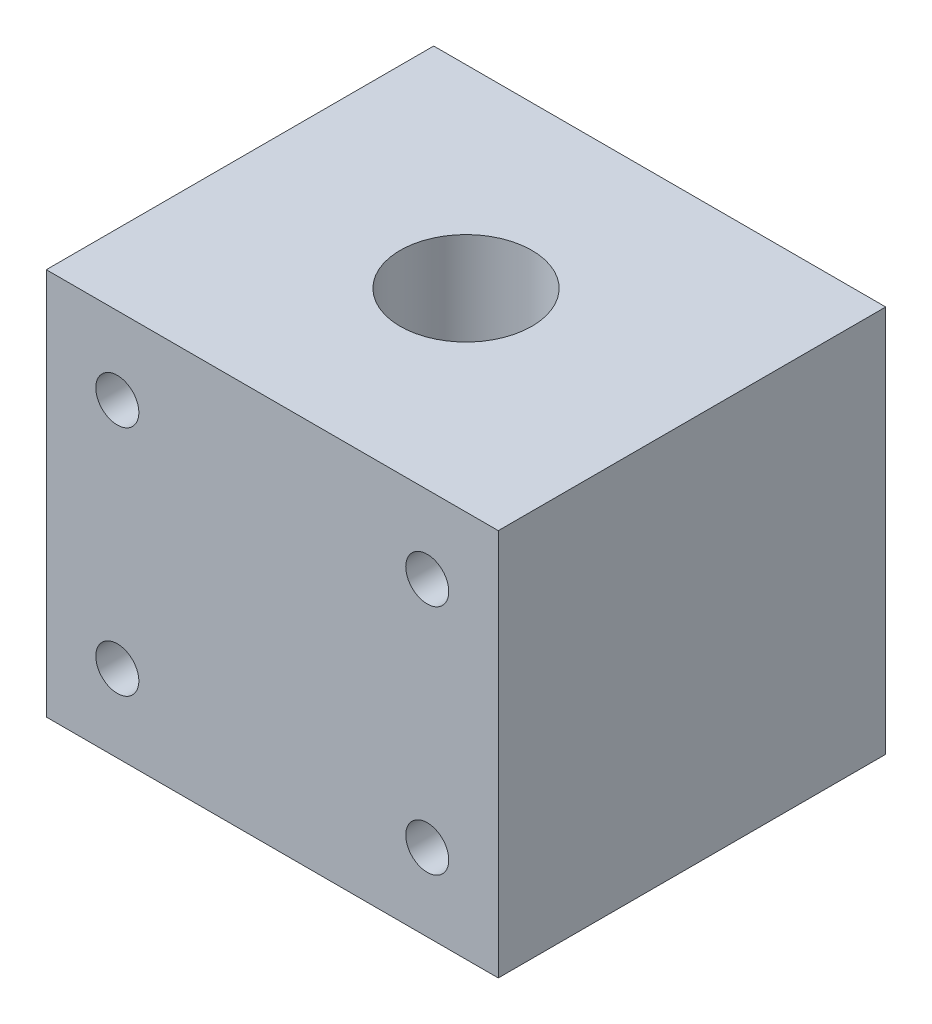
ISO-10303-21;
HEADER;
FILE_DESCRIPTION(('STEP AP214'),'2;1');
FILE_NAME('part.step','',(''),(''),'','','');
FILE_SCHEMA(('AUTOMOTIVE_DESIGN { 1 0 10303 214 1 1 1 1 }'));
ENDSEC;
DATA;
#1=APPLICATION_CONTEXT('core data for automotive mechanical design processes');
#2=APPLICATION_PROTOCOL_DEFINITION('international standard','automotive_design',2000,#1);
#3=PRODUCT_CONTEXT('',#1,'mechanical');
#4=PRODUCT('Part','Part','',(#3));
#5=PRODUCT_RELATED_PRODUCT_CATEGORY('part','',(#4));
#6=PRODUCT_DEFINITION_FORMATION('','',#4);
#7=PRODUCT_DEFINITION_CONTEXT('part definition',#1,'design');
#8=PRODUCT_DEFINITION('design','',#6,#7);
#9=PRODUCT_DEFINITION_SHAPE('','',#8);
#10=(LENGTH_UNIT() NAMED_UNIT(*) SI_UNIT(.MILLI.,.METRE.));
#11=(NAMED_UNIT(*) PLANE_ANGLE_UNIT() SI_UNIT($,.RADIAN.));
#12=(NAMED_UNIT(*) SI_UNIT($,.STERADIAN.) SOLID_ANGLE_UNIT());
#13=UNCERTAINTY_MEASURE_WITH_UNIT(LENGTH_MEASURE(1.E-05),#10,'distance_accuracy_value','');
#14=(GEOMETRIC_REPRESENTATION_CONTEXT(3) GLOBAL_UNCERTAINTY_ASSIGNED_CONTEXT((#13)) GLOBAL_UNIT_ASSIGNED_CONTEXT((#10,
#11,#12)) REPRESENTATION_CONTEXT('',''));
#15=CARTESIAN_POINT('',(0.,0.,0.));
#16=DIRECTION('',(0.,0.,1.));
#17=DIRECTION('',(1.,0.,0.));
#18=AXIS2_PLACEMENT_3D('',#15,#16,#17);
#19=CARTESIAN_POINT('',(0.,30.,0.));
#20=DIRECTION('',(0.,1.,0.));
#21=DIRECTION('',(1.,0.,0.));
#22=AXIS2_PLACEMENT_3D('',#19,#20,#21);
#23=PLANE('',#22);
#24=CARTESIAN_POINT('',(0.,30.,0.));
#25=DIRECTION('',(0.,-1.,0.));
#26=DIRECTION('',(-1.,0.,0.));
#27=AXIS2_PLACEMENT_3D('',#24,#25,#26);
#28=CIRCLE('',#27,5.1);
#29=CARTESIAN_POINT('',(5.1,30.,0.));
#30=VERTEX_POINT('',#29);
#31=EDGE_CURVE('E168',#30,#30,#28,.T.);
#32=ORIENTED_EDGE('',*,*,#31,.T.);
#33=EDGE_LOOP('',(#32));
#34=FACE_BOUND('',#33,.T.);
#35=DIRECTION('',(0.,0.,-1.));
#36=VECTOR('',#35,1.);
#37=CARTESIAN_POINT('',(17.5,30.,15.));
#38=LINE('',#37,#36);
#39=CARTESIAN_POINT('',(17.5,30.,15.));
#40=VERTEX_POINT('',#39);
#41=CARTESIAN_POINT('',(17.5,30.,-15.));
#42=VERTEX_POINT('',#41);
#43=EDGE_CURVE('E11',#40,#42,#38,.T.);
#44=ORIENTED_EDGE('',*,*,#43,.T.);
#45=DIRECTION('',(-1.,0.,0.));
#46=VECTOR('',#45,1.);
#47=CARTESIAN_POINT('',(17.5,30.,-15.));
#48=LINE('',#47,#46);
#49=CARTESIAN_POINT('',(-17.5,30.,-15.));
#50=VERTEX_POINT('',#49);
#51=EDGE_CURVE('E141',#42,#50,#48,.T.);
#52=ORIENTED_EDGE('',*,*,#51,.T.);
#53=DIRECTION('',(0.,0.,1.));
#54=VECTOR('',#53,1.);
#55=CARTESIAN_POINT('',(-17.5,30.,-15.));
#56=LINE('',#55,#54);
#57=CARTESIAN_POINT('',(-17.5,30.,15.));
#58=VERTEX_POINT('',#57);
#59=EDGE_CURVE('E174',#50,#58,#56,.T.);
#60=ORIENTED_EDGE('',*,*,#59,.T.);
#61=DIRECTION('',(1.,0.,0.));
#62=VECTOR('',#61,1.);
#63=CARTESIAN_POINT('',(-17.5,30.,15.));
#64=LINE('',#63,#62);
#65=EDGE_CURVE('E230',#58,#40,#64,.T.);
#66=ORIENTED_EDGE('',*,*,#65,.T.);
#67=EDGE_LOOP('',(#44,#52,#60,#66));
#68=FACE_BOUND('',#67,.T.);
#69=ADVANCED_FACE('F16',(#34,#68),#23,.T.);
#70=CARTESIAN_POINT('',(17.5,0.,15.));
#71=DIRECTION('',(1.,0.,0.));
#72=DIRECTION('',(0.,0.,-1.));
#73=AXIS2_PLACEMENT_3D('',#70,#71,#72);
#74=PLANE('',#73);
#75=DIRECTION('',(0.,0.,-1.));
#76=VECTOR('',#75,1.);
#77=CARTESIAN_POINT('',(17.5,0.,15.));
#78=LINE('',#77,#76);
#79=CARTESIAN_POINT('',(17.5,0.,15.));
#80=VERTEX_POINT('',#79);
#81=CARTESIAN_POINT('',(17.5,0.,-15.));
#82=VERTEX_POINT('',#81);
#83=EDGE_CURVE('E150',#80,#82,#78,.T.);
#84=ORIENTED_EDGE('',*,*,#83,.T.);
#85=DIRECTION('',(0.,1.,0.));
#86=VECTOR('',#85,1.);
#87=CARTESIAN_POINT('',(17.5,0.,-15.));
#88=LINE('',#87,#86);
#89=EDGE_CURVE('E27',#82,#42,#88,.T.);
#90=ORIENTED_EDGE('',*,*,#89,.T.);
#91=ORIENTED_EDGE('',*,*,#43,.F.);
#92=DIRECTION('',(0.,1.,0.));
#93=VECTOR('',#92,1.);
#94=CARTESIAN_POINT('',(17.5,0.,15.));
#95=LINE('',#94,#93);
#96=EDGE_CURVE('E135',#80,#40,#95,.T.);
#97=ORIENTED_EDGE('',*,*,#96,.F.);
#98=EDGE_LOOP('',(#84,#90,#91,#97));
#99=FACE_BOUND('',#98,.T.);
#100=ADVANCED_FACE('F315',(#99),#74,.T.);
#101=CARTESIAN_POINT('',(17.5,0.,-15.));
#102=DIRECTION('',(0.,0.,-1.));
#103=DIRECTION('',(0.,-1.,0.));
#104=AXIS2_PLACEMENT_3D('',#101,#102,#103);
#105=PLANE('',#104);
#106=DIRECTION('',(-1.,0.,0.));
#107=VECTOR('',#106,1.);
#108=CARTESIAN_POINT('',(17.5,0.,-15.));
#109=LINE('',#108,#107);
#110=CARTESIAN_POINT('',(-17.5,0.,-15.));
#111=VERTEX_POINT('',#110);
#112=EDGE_CURVE('E244',#82,#111,#109,.T.);
#113=ORIENTED_EDGE('',*,*,#112,.T.);
#114=DIRECTION('',(0.,1.,0.));
#115=VECTOR('',#114,1.);
#116=CARTESIAN_POINT('',(-17.5,0.,-15.));
#117=LINE('',#116,#115);
#118=EDGE_CURVE('E143',#111,#50,#117,.T.);
#119=ORIENTED_EDGE('',*,*,#118,.T.);
#120=ORIENTED_EDGE('',*,*,#51,.F.);
#121=ORIENTED_EDGE('',*,*,#89,.F.);
#122=EDGE_LOOP('',(#113,#119,#120,#121));
#123=FACE_BOUND('',#122,.T.);
#124=ADVANCED_FACE('F321',(#123),#105,.T.);
#125=CARTESIAN_POINT('',(-17.5,0.,-15.));
#126=DIRECTION('',(-1.,0.,0.));
#127=DIRECTION('',(0.,1.,0.));
#128=AXIS2_PLACEMENT_3D('',#125,#126,#127);
#129=PLANE('',#128);
#130=DIRECTION('',(0.,0.,1.));
#131=VECTOR('',#130,1.);
#132=CARTESIAN_POINT('',(-17.5,0.,-15.));
#133=LINE('',#132,#131);
#134=CARTESIAN_POINT('',(-17.5,0.,15.));
#135=VERTEX_POINT('',#134);
#136=EDGE_CURVE('E241',#111,#135,#133,.T.);
#137=ORIENTED_EDGE('',*,*,#136,.T.);
#138=DIRECTION('',(0.,1.,0.));
#139=VECTOR('',#138,1.);
#140=CARTESIAN_POINT('',(-17.5,0.,15.));
#141=LINE('',#140,#139);
#142=EDGE_CURVE('E178',#135,#58,#141,.T.);
#143=ORIENTED_EDGE('',*,*,#142,.T.);
#144=ORIENTED_EDGE('',*,*,#59,.F.);
#145=ORIENTED_EDGE('',*,*,#118,.F.);
#146=EDGE_LOOP('',(#137,#143,#144,#145));
#147=FACE_BOUND('',#146,.T.);
#148=ADVANCED_FACE('F350',(#147),#129,.T.);
#149=CARTESIAN_POINT('',(-17.5,0.,15.));
#150=DIRECTION('',(0.,0.,1.));
#151=DIRECTION('',(1.,0.,0.));
#152=AXIS2_PLACEMENT_3D('',#149,#150,#151);
#153=PLANE('',#152);
#154=CARTESIAN_POINT('',(-12.,6.,15.));
#155=DIRECTION('',(0.,0.,-1.));
#156=DIRECTION('',(1.,0.,0.));
#157=AXIS2_PLACEMENT_3D('',#154,#155,#156);
#158=CIRCLE('',#157,1.666);
#159=CARTESIAN_POINT('',(-13.666,6.,15.));
#160=VERTEX_POINT('',#159);
#161=EDGE_CURVE('E224',#160,#160,#158,.T.);
#162=ORIENTED_EDGE('',*,*,#161,.T.);
#163=EDGE_LOOP('',(#162));
#164=FACE_BOUND('',#163,.T.);
#165=CARTESIAN_POINT('',(12.,24.,15.));
#166=DIRECTION('',(0.,0.,-1.));
#167=DIRECTION('',(1.,0.,0.));
#168=AXIS2_PLACEMENT_3D('',#165,#166,#167);
#169=CIRCLE('',#168,1.666);
#170=CARTESIAN_POINT('',(10.334,24.,15.));
#171=VERTEX_POINT('',#170);
#172=EDGE_CURVE('E20',#171,#171,#169,.T.);
#173=ORIENTED_EDGE('',*,*,#172,.T.);
#174=EDGE_LOOP('',(#173));
#175=FACE_BOUND('',#174,.T.);
#176=CARTESIAN_POINT('',(-12.,24.,15.));
#177=DIRECTION('',(0.,0.,-1.));
#178=DIRECTION('',(1.,0.,0.));
#179=AXIS2_PLACEMENT_3D('',#176,#177,#178);
#180=CIRCLE('',#179,1.666);
#181=CARTESIAN_POINT('',(-13.666,24.,15.));
#182=VERTEX_POINT('',#181);
#183=EDGE_CURVE('E116',#182,#182,#180,.T.);
#184=ORIENTED_EDGE('',*,*,#183,.T.);
#185=EDGE_LOOP('',(#184));
#186=FACE_BOUND('',#185,.T.);
#187=CARTESIAN_POINT('',(12.,6.,15.));
#188=DIRECTION('',(0.,0.,-1.));
#189=DIRECTION('',(1.,0.,0.));
#190=AXIS2_PLACEMENT_3D('',#187,#188,#189);
#191=CIRCLE('',#190,1.666);
#192=CARTESIAN_POINT('',(10.334,6.,15.));
#193=VERTEX_POINT('',#192);
#194=EDGE_CURVE('E166',#193,#193,#191,.T.);
#195=ORIENTED_EDGE('',*,*,#194,.T.);
#196=EDGE_LOOP('',(#195));
#197=FACE_BOUND('',#196,.T.);
#198=DIRECTION('',(1.,0.,0.));
#199=VECTOR('',#198,1.);
#200=CARTESIAN_POINT('',(-17.5,0.,15.));
#201=LINE('',#200,#199);
#202=EDGE_CURVE('E154',#135,#80,#201,.T.);
#203=ORIENTED_EDGE('',*,*,#202,.T.);
#204=ORIENTED_EDGE('',*,*,#96,.T.);
#205=ORIENTED_EDGE('',*,*,#65,.F.);
#206=ORIENTED_EDGE('',*,*,#142,.F.);
#207=EDGE_LOOP('',(#203,#204,#205,#206));
#208=FACE_BOUND('',#207,.T.);
#209=ADVANCED_FACE('F292',(#164,#175,#186,#197,#208),#153,.T.);
#210=CARTESIAN_POINT('',(0.,0.,0.));
#211=DIRECTION('',(0.,1.,0.));
#212=DIRECTION('',(1.,0.,0.));
#213=AXIS2_PLACEMENT_3D('',#210,#211,#212);
#214=PLANE('',#213);
#215=CARTESIAN_POINT('',(0.,0.,0.));
#216=DIRECTION('',(0.,1.,0.));
#217=DIRECTION('',(-1.,0.,0.));
#218=AXIS2_PLACEMENT_3D('',#215,#216,#217);
#219=CIRCLE('',#218,11.);
#220=CARTESIAN_POINT('',(11.,0.,0.));
#221=VERTEX_POINT('',#220);
#222=EDGE_CURVE('E204',#221,#221,#219,.T.);
#223=ORIENTED_EDGE('',*,*,#222,.T.);
#224=EDGE_LOOP('',(#223));
#225=FACE_BOUND('',#224,.T.);
#226=ORIENTED_EDGE('',*,*,#83,.F.);
#227=ORIENTED_EDGE('',*,*,#202,.F.);
#228=ORIENTED_EDGE('',*,*,#136,.F.);
#229=ORIENTED_EDGE('',*,*,#112,.F.);
#230=EDGE_LOOP('',(#226,#227,#228,#229));
#231=FACE_BOUND('',#230,.T.);
#232=ADVANCED_FACE('F347',(#225,#231),#214,.F.);
#233=CARTESIAN_POINT('',(0.,4.,0.));
#234=DIRECTION('',(0.,1.,0.));
#235=DIRECTION('',(1.,0.,0.));
#236=AXIS2_PLACEMENT_3D('',#233,#234,#235);
#237=PLANE('',#236);
#238=CARTESIAN_POINT('',(0.,4.,0.));
#239=DIRECTION('',(0.,-1.,0.));
#240=DIRECTION('',(-1.,0.,0.));
#241=AXIS2_PLACEMENT_3D('',#238,#239,#240);
#242=CIRCLE('',#241,5.1);
#243=CARTESIAN_POINT('',(5.1,4.,0.));
#244=VERTEX_POINT('',#243);
#245=EDGE_CURVE('E202',#244,#244,#242,.T.);
#246=ORIENTED_EDGE('',*,*,#245,.F.);
#247=EDGE_LOOP('',(#246));
#248=FACE_BOUND('',#247,.T.);
#249=CARTESIAN_POINT('',(8.,4.,0.));
#250=DIRECTION('',(0.,1.,0.));
#251=DIRECTION('',(0.,0.,-1.));
#252=AXIS2_PLACEMENT_3D('',#249,#250,#251);
#253=CIRCLE('',#252,1.2645);
#254=CARTESIAN_POINT('',(8.,4.,1.2645));
#255=VERTEX_POINT('',#254);
#256=EDGE_CURVE('E191',#255,#255,#253,.T.);
#257=ORIENTED_EDGE('',*,*,#256,.T.);
#258=EDGE_LOOP('',(#257));
#259=FACE_BOUND('',#258,.T.);
#260=CARTESIAN_POINT('',(-8.,4.,0.));
#261=DIRECTION('',(0.,1.,0.));
#262=DIRECTION('',(0.,0.,-1.));
#263=AXIS2_PLACEMENT_3D('',#260,#261,#262);
#264=CIRCLE('',#263,1.2645);
#265=CARTESIAN_POINT('',(-8.,4.,1.2645));
#266=VERTEX_POINT('',#265);
#267=EDGE_CURVE('E162',#266,#266,#264,.T.);
#268=ORIENTED_EDGE('',*,*,#267,.T.);
#269=EDGE_LOOP('',(#268));
#270=FACE_BOUND('',#269,.T.);
#271=CARTESIAN_POINT('',(0.,4.,0.));
#272=DIRECTION('',(0.,1.,0.));
#273=DIRECTION('',(-1.,0.,0.));
#274=AXIS2_PLACEMENT_3D('',#271,#272,#273);
#275=CIRCLE('',#274,11.);
#276=CARTESIAN_POINT('',(11.,4.,0.));
#277=VERTEX_POINT('',#276);
#278=EDGE_CURVE('E155',#277,#277,#275,.T.);
#279=ORIENTED_EDGE('',*,*,#278,.F.);
#280=EDGE_LOOP('',(#279));
#281=FACE_BOUND('',#280,.T.);
#282=ADVANCED_FACE('F344',(#248,#259,#270,#281),#237,.F.);
#283=CARTESIAN_POINT('',(0.,0.,0.));
#284=DIRECTION('',(0.,1.,0.));
#285=DIRECTION('',(-1.,0.,0.));
#286=AXIS2_PLACEMENT_3D('',#283,#284,#285);
#287=CYLINDRICAL_SURFACE('',#286,11.);
#288=ORIENTED_EDGE('',*,*,#222,.F.);
#289=DIRECTION('',(0.,1.,0.));
#290=VECTOR('',#289,1.);
#291=CARTESIAN_POINT('',(11.,0.,0.));
#292=LINE('',#291,#290);
#293=EDGE_CURVE('E205',#221,#277,#292,.T.);
#294=ORIENTED_EDGE('',*,*,#293,.T.);
#295=ORIENTED_EDGE('',*,*,#278,.T.);
#296=ORIENTED_EDGE('',*,*,#293,.F.);
#297=EDGE_LOOP('',(#288,#294,#295,#296));
#298=FACE_BOUND('',#297,.T.);
#299=ADVANCED_FACE('F342',(#298),#287,.F.);
#300=CARTESIAN_POINT('',(0.,0.,0.));
#301=DIRECTION('',(0.,1.,0.));
#302=DIRECTION('',(-1.,0.,0.));
#303=AXIS2_PLACEMENT_3D('',#300,#301,#302);
#304=CYLINDRICAL_SURFACE('',#303,5.1);
#305=ORIENTED_EDGE('',*,*,#31,.F.);
#306=DIRECTION('',(0.,-1.,0.));
#307=VECTOR('',#306,1.);
#308=CARTESIAN_POINT('',(5.1,0.,0.));
#309=LINE('',#308,#307);
#310=EDGE_CURVE('E172',#30,#244,#309,.T.);
#311=ORIENTED_EDGE('',*,*,#310,.T.);
#312=ORIENTED_EDGE('',*,*,#245,.T.);
#313=ORIENTED_EDGE('',*,*,#310,.F.);
#314=EDGE_LOOP('',(#305,#311,#312,#313));
#315=FACE_BOUND('',#314,.T.);
#316=ADVANCED_FACE('F339',(#315),#304,.F.);
#317=CARTESIAN_POINT('',(8.,8.5,0.));
#318=DIRECTION('',(0.,1.,0.));
#319=DIRECTION('',(0.,0.,-1.));
#320=AXIS2_PLACEMENT_3D('',#317,#318,#319);
#321=CYLINDRICAL_SURFACE('',#320,1.2645);
#322=ORIENTED_EDGE('',*,*,#256,.F.);
#323=DIRECTION('',(0.,1.,0.));
#324=VECTOR('',#323,1.);
#325=CARTESIAN_POINT('',(8.,8.5,1.2645));
#326=LINE('',#325,#324);
#327=CARTESIAN_POINT('',(8.,13.,1.2645));
#328=VERTEX_POINT('',#327);
#329=EDGE_CURVE('E173',#255,#328,#326,.T.);
#330=ORIENTED_EDGE('',*,*,#329,.T.);
#331=CARTESIAN_POINT('',(8.,13.,0.));
#332=DIRECTION('',(0.,1.,0.));
#333=DIRECTION('',(0.,0.,-1.));
#334=AXIS2_PLACEMENT_3D('',#331,#332,#333);
#335=CIRCLE('',#334,1.2645);
#336=EDGE_CURVE('E161',#328,#328,#335,.T.);
#337=ORIENTED_EDGE('',*,*,#336,.T.);
#338=ORIENTED_EDGE('',*,*,#329,.F.);
#339=EDGE_LOOP('',(#322,#330,#337,#338));
#340=FACE_BOUND('',#339,.T.);
#341=ADVANCED_FACE('F18',(#340),#321,.F.);
#342=CARTESIAN_POINT('',(8.,13.3798236046367,0.));
#343=DIRECTION('',(0.,-1.,0.));
#344=DIRECTION('',(0.,0.,-1.));
#345=AXIS2_PLACEMENT_3D('',#342,#343,#344);
#346=CONICAL_SURFACE('',#345,0.632367367890697,1.02974425867665);
#347=ORIENTED_EDGE('',*,*,#336,.F.);
#348=DIRECTION('',(0.,0.515038074910054,-0.857167300702112));
#349=VECTOR('',#348,1.);
#350=CARTESIAN_POINT('',(8.,13.3798236046367,0.632367367890697));
#351=LINE('',#350,#349);
#352=CARTESIAN_POINT('',(8.,13.7597882527603,0.));
#353=VERTEX_POINT('',#352);
#354=EDGE_CURVE('E187',#328,#353,#351,.T.);
#355=ORIENTED_EDGE('',*,*,#354,.T.);
#356=ORIENTED_EDGE('',*,*,#354,.F.);
#357=EDGE_LOOP('',(#347,#355,#356));
#358=FACE_BOUND('',#357,.T.);
#359=ADVANCED_FACE('F468',(#358),#346,.F.);
#360=CARTESIAN_POINT('',(-8.,8.5,0.));
#361=DIRECTION('',(0.,1.,0.));
#362=DIRECTION('',(0.,0.,-1.));
#363=AXIS2_PLACEMENT_3D('',#360,#361,#362);
#364=CYLINDRICAL_SURFACE('',#363,1.2645);
#365=ORIENTED_EDGE('',*,*,#267,.F.);
#366=DIRECTION('',(0.,1.,0.));
#367=VECTOR('',#366,1.);
#368=CARTESIAN_POINT('',(-8.,8.5,1.2645));
#369=LINE('',#368,#367);
#370=CARTESIAN_POINT('',(-8.,13.,1.2645));
#371=VERTEX_POINT('',#370);
#372=EDGE_CURVE('E158',#266,#371,#369,.T.);
#373=ORIENTED_EDGE('',*,*,#372,.T.);
#374=CARTESIAN_POINT('',(-8.,13.,0.));
#375=DIRECTION('',(0.,1.,0.));
#376=DIRECTION('',(0.,0.,-1.));
#377=AXIS2_PLACEMENT_3D('',#374,#375,#376);
#378=CIRCLE('',#377,1.2645);
#379=EDGE_CURVE('E186',#371,#371,#378,.T.);
#380=ORIENTED_EDGE('',*,*,#379,.T.);
#381=ORIENTED_EDGE('',*,*,#372,.F.);
#382=EDGE_LOOP('',(#365,#373,#380,#381));
#383=FACE_BOUND('',#382,.T.);
#384=ADVANCED_FACE('F473',(#383),#364,.F.);
#385=CARTESIAN_POINT('',(-8.,13.3798236046367,0.));
#386=DIRECTION('',(0.,-1.,0.));
#387=DIRECTION('',(0.,0.,-1.));
#388=AXIS2_PLACEMENT_3D('',#385,#386,#387);
#389=CONICAL_SURFACE('',#388,0.632367367890697,1.02974425867665);
#390=ORIENTED_EDGE('',*,*,#379,.F.);
#391=DIRECTION('',(0.,0.515038074910054,-0.857167300702112));
#392=VECTOR('',#391,1.);
#393=CARTESIAN_POINT('',(-8.,13.3798236046367,0.632367367890697));
#394=LINE('',#393,#392);
#395=CARTESIAN_POINT('',(-8.,13.7597882527603,0.));
#396=VERTEX_POINT('',#395);
#397=EDGE_CURVE('E182',#371,#396,#394,.T.);
#398=ORIENTED_EDGE('',*,*,#397,.T.);
#399=ORIENTED_EDGE('',*,*,#397,.F.);
#400=EDGE_LOOP('',(#390,#398,#399));
#401=FACE_BOUND('',#400,.T.);
#402=ADVANCED_FACE('F483',(#401),#389,.F.);
#403=CARTESIAN_POINT('',(-12.,6.,9.5));
#404=DIRECTION('',(0.,0.,-1.));
#405=DIRECTION('',(1.,0.,0.));
#406=AXIS2_PLACEMENT_3D('',#403,#404,#405);
#407=CYLINDRICAL_SURFACE('',#406,1.666);
#408=ORIENTED_EDGE('',*,*,#161,.F.);
#409=DIRECTION('',(0.,0.,-1.));
#410=VECTOR('',#409,1.);
#411=CARTESIAN_POINT('',(-13.666,6.,9.5));
#412=LINE('',#411,#410);
#413=CARTESIAN_POINT('',(-13.666,6.,4.));
#414=VERTEX_POINT('',#413);
#415=EDGE_CURVE('E236',#160,#414,#412,.T.);
#416=ORIENTED_EDGE('',*,*,#415,.T.);
#417=CARTESIAN_POINT('',(-12.,6.,4.));
#418=DIRECTION('',(0.,0.,-1.));
#419=DIRECTION('',(1.,0.,0.));
#420=AXIS2_PLACEMENT_3D('',#417,#418,#419);
#421=CIRCLE('',#420,1.666);
#422=EDGE_CURVE('E148',#414,#414,#421,.T.);
#423=ORIENTED_EDGE('',*,*,#422,.T.);
#424=ORIENTED_EDGE('',*,*,#415,.F.);
#425=EDGE_LOOP('',(#408,#416,#423,#424));
#426=FACE_BOUND('',#425,.T.);
#427=ADVANCED_FACE('F478',(#426),#407,.F.);
#428=CARTESIAN_POINT('',(-12.,6.,3.49934206086313));
#429=DIRECTION('',(0.,0.,1.));
#430=DIRECTION('',(1.,0.,0.));
#431=AXIS2_PLACEMENT_3D('',#428,#429,#430);
#432=CONICAL_SURFACE('',#431,0.832765264218607,1.02974425867665);
#433=ORIENTED_EDGE('',*,*,#422,.F.);
#434=DIRECTION('',(0.857167300702112,0.,-0.515038074910054));
#435=VECTOR('',#434,1.);
#436=CARTESIAN_POINT('',(-12.8327652642186,6.,3.49934206086313));
#437=LINE('',#436,#435);
#438=CARTESIAN_POINT('',(-12.,6.,2.99896620870009));
#439=VERTEX_POINT('',#438);
#440=EDGE_CURVE('E195',#414,#439,#437,.T.);
#441=ORIENTED_EDGE('',*,*,#440,.T.);
#442=ORIENTED_EDGE('',*,*,#440,.F.);
#443=EDGE_LOOP('',(#433,#441,#442));
#444=FACE_BOUND('',#443,.T.);
#445=ADVANCED_FACE('F310',(#444),#432,.F.);
#446=CARTESIAN_POINT('',(12.,24.,9.5));
#447=DIRECTION('',(0.,0.,-1.));
#448=DIRECTION('',(1.,0.,0.));
#449=AXIS2_PLACEMENT_3D('',#446,#447,#448);
#450=CYLINDRICAL_SURFACE('',#449,1.666);
#451=ORIENTED_EDGE('',*,*,#172,.F.);
#452=DIRECTION('',(0.,0.,-1.));
#453=VECTOR('',#452,1.);
#454=CARTESIAN_POINT('',(10.334,24.,9.5));
#455=LINE('',#454,#453);
#456=CARTESIAN_POINT('',(10.334,24.,4.));
#457=VERTEX_POINT('',#456);
#458=EDGE_CURVE('E145',#171,#457,#455,.T.);
#459=ORIENTED_EDGE('',*,*,#458,.T.);
#460=CARTESIAN_POINT('',(12.,24.,4.));
#461=DIRECTION('',(0.,0.,-1.));
#462=DIRECTION('',(1.,0.,0.));
#463=AXIS2_PLACEMENT_3D('',#460,#461,#462);
#464=CIRCLE('',#463,1.666);
#465=EDGE_CURVE('E118',#457,#457,#464,.T.);
#466=ORIENTED_EDGE('',*,*,#465,.T.);
#467=ORIENTED_EDGE('',*,*,#458,.F.);
#468=EDGE_LOOP('',(#451,#459,#466,#467));
#469=FACE_BOUND('',#468,.T.);
#470=ADVANCED_FACE('F298',(#469),#450,.F.);
#471=CARTESIAN_POINT('',(12.,24.,3.49934206086313));
#472=DIRECTION('',(0.,0.,1.));
#473=DIRECTION('',(1.,0.,0.));
#474=AXIS2_PLACEMENT_3D('',#471,#472,#473);
#475=CONICAL_SURFACE('',#474,0.832765264218607,1.02974425867665);
#476=ORIENTED_EDGE('',*,*,#465,.F.);
#477=DIRECTION('',(0.857167300702112,0.,-0.515038074910054));
#478=VECTOR('',#477,1.);
#479=CARTESIAN_POINT('',(11.1672347357814,24.,3.49934206086313));
#480=LINE('',#479,#478);
#481=CARTESIAN_POINT('',(12.,24.,2.99896620870009));
#482=VERTEX_POINT('',#481);
#483=EDGE_CURVE('E140',#457,#482,#480,.T.);
#484=ORIENTED_EDGE('',*,*,#483,.T.);
#485=ORIENTED_EDGE('',*,*,#483,.F.);
#486=EDGE_LOOP('',(#476,#484,#485));
#487=FACE_BOUND('',#486,.T.);
#488=ADVANCED_FACE('F301',(#487),#475,.F.);
#489=CARTESIAN_POINT('',(-12.,24.,9.5));
#490=DIRECTION('',(0.,0.,-1.));
#491=DIRECTION('',(1.,0.,0.));
#492=AXIS2_PLACEMENT_3D('',#489,#490,#491);
#493=CYLINDRICAL_SURFACE('',#492,1.666);
#494=ORIENTED_EDGE('',*,*,#183,.F.);
#495=DIRECTION('',(0.,0.,-1.));
#496=VECTOR('',#495,1.);
#497=CARTESIAN_POINT('',(-13.666,24.,9.5));
#498=LINE('',#497,#496);
#499=CARTESIAN_POINT('',(-13.666,24.,4.));
#500=VERTEX_POINT('',#499);
#501=EDGE_CURVE('E110',#182,#500,#498,.T.);
#502=ORIENTED_EDGE('',*,*,#501,.T.);
#503=CARTESIAN_POINT('',(-12.,24.,4.));
#504=DIRECTION('',(0.,0.,-1.));
#505=DIRECTION('',(1.,0.,0.));
#506=AXIS2_PLACEMENT_3D('',#503,#504,#505);
#507=CIRCLE('',#506,1.666);
#508=EDGE_CURVE('E114',#500,#500,#507,.T.);
#509=ORIENTED_EDGE('',*,*,#508,.T.);
#510=ORIENTED_EDGE('',*,*,#501,.F.);
#511=EDGE_LOOP('',(#494,#502,#509,#510));
#512=FACE_BOUND('',#511,.T.);
#513=ADVANCED_FACE('F112',(#512),#493,.F.);
#514=CARTESIAN_POINT('',(-12.,24.,3.49934206086313));
#515=DIRECTION('',(0.,0.,1.));
#516=DIRECTION('',(1.,0.,0.));
#517=AXIS2_PLACEMENT_3D('',#514,#515,#516);
#518=CONICAL_SURFACE('',#517,0.832765264218607,1.02974425867665);
#519=ORIENTED_EDGE('',*,*,#508,.F.);
#520=DIRECTION('',(0.857167300702112,0.,-0.515038074910054));
#521=VECTOR('',#520,1.);
#522=CARTESIAN_POINT('',(-12.8327652642186,24.,3.49934206086313));
#523=LINE('',#522,#521);
#524=CARTESIAN_POINT('',(-12.,24.,2.99896620870009));
#525=VERTEX_POINT('',#524);
#526=EDGE_CURVE('E121',#500,#525,#523,.T.);
#527=ORIENTED_EDGE('',*,*,#526,.T.);
#528=ORIENTED_EDGE('',*,*,#526,.F.);
#529=EDGE_LOOP('',(#519,#527,#528));
#530=FACE_BOUND('',#529,.T.);
#531=ADVANCED_FACE('F122',(#530),#518,.F.);
#532=CARTESIAN_POINT('',(12.,6.,9.5));
#533=DIRECTION('',(0.,0.,-1.));
#534=DIRECTION('',(1.,0.,0.));
#535=AXIS2_PLACEMENT_3D('',#532,#533,#534);
#536=CYLINDRICAL_SURFACE('',#535,1.666);
#537=ORIENTED_EDGE('',*,*,#194,.F.);
#538=DIRECTION('',(0.,0.,-1.));
#539=VECTOR('',#538,1.);
#540=CARTESIAN_POINT('',(10.334,6.,9.5));
#541=LINE('',#540,#539);
#542=CARTESIAN_POINT('',(10.334,6.,4.));
#543=VERTEX_POINT('',#542);
#544=EDGE_CURVE('E131',#193,#543,#541,.T.);
#545=ORIENTED_EDGE('',*,*,#544,.T.);
#546=CARTESIAN_POINT('',(12.,6.,4.));
#547=DIRECTION('',(0.,0.,-1.));
#548=DIRECTION('',(1.,0.,0.));
#549=AXIS2_PLACEMENT_3D('',#546,#547,#548);
#550=CIRCLE('',#549,1.666);
#551=EDGE_CURVE('E167',#543,#543,#550,.T.);
#552=ORIENTED_EDGE('',*,*,#551,.T.);
#553=ORIENTED_EDGE('',*,*,#544,.F.);
#554=EDGE_LOOP('',(#537,#545,#552,#553));
#555=FACE_BOUND('',#554,.T.);
#556=ADVANCED_FACE('F326',(#555),#536,.F.);
#557=CARTESIAN_POINT('',(12.,6.,3.49934206086313));
#558=DIRECTION('',(0.,0.,1.));
#559=DIRECTION('',(1.,0.,0.));
#560=AXIS2_PLACEMENT_3D('',#557,#558,#559);
#561=CONICAL_SURFACE('',#560,0.832765264218607,1.02974425867665);
#562=ORIENTED_EDGE('',*,*,#551,.F.);
#563=DIRECTION('',(0.857167300702112,0.,-0.515038074910054));
#564=VECTOR('',#563,1.);
#565=CARTESIAN_POINT('',(11.1672347357814,6.,3.49934206086313));
#566=LINE('',#565,#564);
#567=CARTESIAN_POINT('',(12.,6.,2.99896620870009));
#568=VERTEX_POINT('',#567);
#569=EDGE_CURVE('E163',#543,#568,#566,.T.);
#570=ORIENTED_EDGE('',*,*,#569,.T.);
#571=ORIENTED_EDGE('',*,*,#569,.F.);
#572=EDGE_LOOP('',(#562,#570,#571));
#573=FACE_BOUND('',#572,.T.);
#574=ADVANCED_FACE('F330',(#573),#561,.F.);
#575=CLOSED_SHELL('',(#69,#100,#124,#148,#209,#232,#282,#299,#316,#341,#359,#384,#402,#427,#445,
#470,#488,#513,#531,#556,#574));
#576=MANIFOLD_SOLID_BREP('B1',#575);
#577=ADVANCED_BREP_SHAPE_REPRESENTATION('',(#18,#576),#14);
#578=SHAPE_DEFINITION_REPRESENTATION(#9,#577);
ENDSEC;
END-ISO-10303-21;
